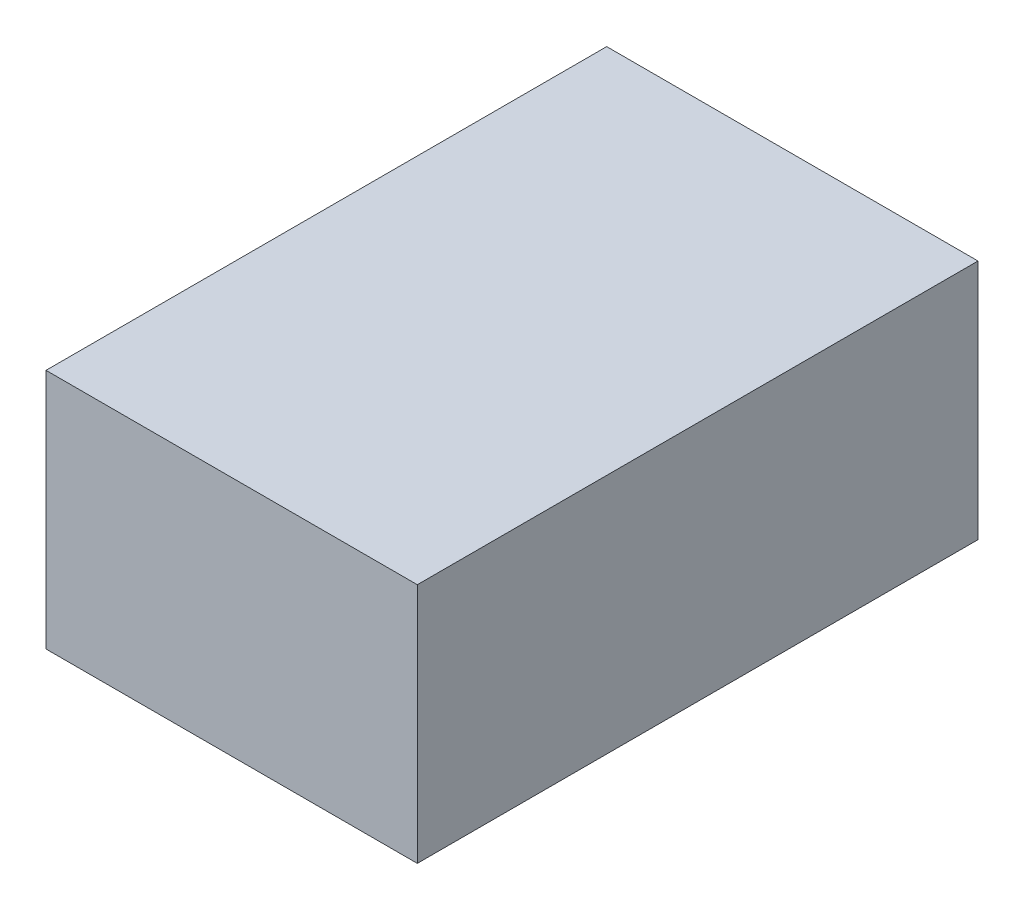
ISO-10303-21;
HEADER;
FILE_DESCRIPTION(('STEP AP214'),'2;1');
FILE_NAME('part.step','',(''),(''),'','','');
FILE_SCHEMA(('AUTOMOTIVE_DESIGN { 1 0 10303 214 1 1 1 1 }'));
ENDSEC;
DATA;
#1=APPLICATION_CONTEXT('core data for automotive mechanical design processes');
#2=APPLICATION_PROTOCOL_DEFINITION('international standard','automotive_design',2000,#1);
#3=PRODUCT_CONTEXT('',#1,'mechanical');
#4=PRODUCT('Part','Part','',(#3));
#5=PRODUCT_RELATED_PRODUCT_CATEGORY('part','',(#4));
#6=PRODUCT_DEFINITION_FORMATION('','',#4);
#7=PRODUCT_DEFINITION_CONTEXT('part definition',#1,'design');
#8=PRODUCT_DEFINITION('design','',#6,#7);
#9=PRODUCT_DEFINITION_SHAPE('','',#8);
#10=(LENGTH_UNIT() NAMED_UNIT(*) SI_UNIT(.MILLI.,.METRE.));
#11=(NAMED_UNIT(*) PLANE_ANGLE_UNIT() SI_UNIT($,.RADIAN.));
#12=(NAMED_UNIT(*) SI_UNIT($,.STERADIAN.) SOLID_ANGLE_UNIT());
#13=UNCERTAINTY_MEASURE_WITH_UNIT(LENGTH_MEASURE(1.E-05),#10,'distance_accuracy_value','');
#14=(GEOMETRIC_REPRESENTATION_CONTEXT(3) GLOBAL_UNCERTAINTY_ASSIGNED_CONTEXT((#13)) GLOBAL_UNIT_ASSIGNED_CONTEXT((#10,
#11,#12)) REPRESENTATION_CONTEXT('',''));
#15=CARTESIAN_POINT('',(0.,0.,0.));
#16=DIRECTION('',(0.,0.,1.));
#17=DIRECTION('',(1.,0.,0.));
#18=AXIS2_PLACEMENT_3D('',#15,#16,#17);
#19=CARTESIAN_POINT('',(50.,-32.5,151.));
#20=DIRECTION('',(-1.,0.,0.));
#21=DIRECTION('',(0.,0.,1.));
#22=AXIS2_PLACEMENT_3D('',#19,#20,#21);
#23=PLANE('',#22);
#24=DIRECTION('',(0.,1.,0.));
#25=VECTOR('',#24,1.);
#26=CARTESIAN_POINT('',(50.,-32.5,0.));
#27=LINE('',#26,#25);
#28=CARTESIAN_POINT('',(50.,-32.5,0.));
#29=VERTEX_POINT('',#28);
#30=CARTESIAN_POINT('',(50.,32.5,0.));
#31=VERTEX_POINT('',#30);
#32=EDGE_CURVE('E96',#29,#31,#27,.T.);
#33=ORIENTED_EDGE('',*,*,#32,.T.);
#34=DIRECTION('',(0.,0.,-1.));
#35=VECTOR('',#34,1.);
#36=CARTESIAN_POINT('',(50.,32.5,151.));
#37=LINE('',#36,#35);
#38=CARTESIAN_POINT('',(50.,32.5,151.));
#39=VERTEX_POINT('',#38);
#40=EDGE_CURVE('E11',#39,#31,#37,.T.);
#41=ORIENTED_EDGE('',*,*,#40,.F.);
#42=DIRECTION('',(0.,1.,0.));
#43=VECTOR('',#42,1.);
#44=CARTESIAN_POINT('',(50.,-32.5,151.));
#45=LINE('',#44,#43);
#46=CARTESIAN_POINT('',(50.,-32.5,151.));
#47=VERTEX_POINT('',#46);
#48=EDGE_CURVE('E84',#47,#39,#45,.T.);
#49=ORIENTED_EDGE('',*,*,#48,.F.);
#50=DIRECTION('',(0.,0.,-1.));
#51=VECTOR('',#50,1.);
#52=CARTESIAN_POINT('',(50.,-32.5,151.));
#53=LINE('',#52,#51);
#54=EDGE_CURVE('E92',#47,#29,#53,.T.);
#55=ORIENTED_EDGE('',*,*,#54,.T.);
#56=EDGE_LOOP('',(#33,#41,#49,#55));
#57=FACE_BOUND('',#56,.T.);
#58=ADVANCED_FACE('F33',(#57),#23,.F.);
#59=CARTESIAN_POINT('',(-50.,32.5,151.));
#60=DIRECTION('',(0.,-1.,0.));
#61=DIRECTION('',(0.,0.,-1.));
#62=AXIS2_PLACEMENT_3D('',#59,#60,#61);
#63=PLANE('',#62);
#64=DIRECTION('',(-1.,0.,0.));
#65=VECTOR('',#64,1.);
#66=CARTESIAN_POINT('',(-50.,32.5,0.));
#67=LINE('',#66,#65);
#68=CARTESIAN_POINT('',(-50.,32.5,0.));
#69=VERTEX_POINT('',#68);
#70=EDGE_CURVE('E88',#31,#69,#67,.T.);
#71=ORIENTED_EDGE('',*,*,#70,.T.);
#72=DIRECTION('',(0.,0.,-1.));
#73=VECTOR('',#72,1.);
#74=CARTESIAN_POINT('',(-50.,32.5,151.));
#75=LINE('',#74,#73);
#76=CARTESIAN_POINT('',(-50.,32.5,151.));
#77=VERTEX_POINT('',#76);
#78=EDGE_CURVE('E41',#77,#69,#75,.T.);
#79=ORIENTED_EDGE('',*,*,#78,.F.);
#80=DIRECTION('',(-1.,0.,0.));
#81=VECTOR('',#80,1.);
#82=CARTESIAN_POINT('',(-50.,32.5,151.));
#83=LINE('',#82,#81);
#84=EDGE_CURVE('E79',#39,#77,#83,.T.);
#85=ORIENTED_EDGE('',*,*,#84,.F.);
#86=ORIENTED_EDGE('',*,*,#40,.T.);
#87=EDGE_LOOP('',(#71,#79,#85,#86));
#88=FACE_BOUND('',#87,.T.);
#89=ADVANCED_FACE('F87',(#88),#63,.F.);
#90=CARTESIAN_POINT('',(-50.,-32.5,151.));
#91=DIRECTION('',(1.,0.,0.));
#92=DIRECTION('',(0.,0.,-1.));
#93=AXIS2_PLACEMENT_3D('',#90,#91,#92);
#94=PLANE('',#93);
#95=DIRECTION('',(0.,-1.,0.));
#96=VECTOR('',#95,1.);
#97=CARTESIAN_POINT('',(-50.,-32.5,0.));
#98=LINE('',#97,#96);
#99=CARTESIAN_POINT('',(-50.,-32.5,0.));
#100=VERTEX_POINT('',#99);
#101=EDGE_CURVE('E66',#69,#100,#98,.T.);
#102=ORIENTED_EDGE('',*,*,#101,.T.);
#103=DIRECTION('',(0.,0.,-1.));
#104=VECTOR('',#103,1.);
#105=CARTESIAN_POINT('',(-50.,-32.5,151.));
#106=LINE('',#105,#104);
#107=CARTESIAN_POINT('',(-50.,-32.5,151.));
#108=VERTEX_POINT('',#107);
#109=EDGE_CURVE('E89',#108,#100,#106,.T.);
#110=ORIENTED_EDGE('',*,*,#109,.F.);
#111=DIRECTION('',(0.,-1.,0.));
#112=VECTOR('',#111,1.);
#113=CARTESIAN_POINT('',(-50.,-32.5,151.));
#114=LINE('',#113,#112);
#115=EDGE_CURVE('E82',#77,#108,#114,.T.);
#116=ORIENTED_EDGE('',*,*,#115,.F.);
#117=ORIENTED_EDGE('',*,*,#78,.T.);
#118=EDGE_LOOP('',(#102,#110,#116,#117));
#119=FACE_BOUND('',#118,.T.);
#120=ADVANCED_FACE('F90',(#119),#94,.F.);
#121=CARTESIAN_POINT('',(-50.,-32.5,151.));
#122=DIRECTION('',(0.,1.,0.));
#123=DIRECTION('',(0.,0.,1.));
#124=AXIS2_PLACEMENT_3D('',#121,#122,#123);
#125=PLANE('',#124);
#126=DIRECTION('',(1.,0.,0.));
#127=VECTOR('',#126,1.);
#128=CARTESIAN_POINT('',(-50.,-32.5,0.));
#129=LINE('',#128,#127);
#130=EDGE_CURVE('E72',#100,#29,#129,.T.);
#131=ORIENTED_EDGE('',*,*,#130,.T.);
#132=ORIENTED_EDGE('',*,*,#54,.F.);
#133=DIRECTION('',(1.,0.,0.));
#134=VECTOR('',#133,1.);
#135=CARTESIAN_POINT('',(-50.,-32.5,151.));
#136=LINE('',#135,#134);
#137=EDGE_CURVE('E49',#108,#47,#136,.T.);
#138=ORIENTED_EDGE('',*,*,#137,.F.);
#139=ORIENTED_EDGE('',*,*,#109,.T.);
#140=EDGE_LOOP('',(#131,#132,#138,#139));
#141=FACE_BOUND('',#140,.T.);
#142=ADVANCED_FACE('F103',(#141),#125,.F.);
#143=CARTESIAN_POINT('',(0.,0.,151.));
#144=DIRECTION('',(0.,0.,-1.));
#145=DIRECTION('',(-1.,0.,0.));
#146=AXIS2_PLACEMENT_3D('',#143,#144,#145);
#147=PLANE('',#146);
#148=ORIENTED_EDGE('',*,*,#48,.T.);
#149=ORIENTED_EDGE('',*,*,#84,.T.);
#150=ORIENTED_EDGE('',*,*,#115,.T.);
#151=ORIENTED_EDGE('',*,*,#137,.T.);
#152=EDGE_LOOP('',(#148,#149,#150,#151));
#153=FACE_BOUND('',#152,.T.);
#154=ADVANCED_FACE('F80',(#153),#147,.F.);
#155=CARTESIAN_POINT('',(0.,0.,0.));
#156=DIRECTION('',(0.,0.,-1.));
#157=DIRECTION('',(-1.,0.,0.));
#158=AXIS2_PLACEMENT_3D('',#155,#156,#157);
#159=PLANE('',#158);
#160=ORIENTED_EDGE('',*,*,#32,.F.);
#161=ORIENTED_EDGE('',*,*,#130,.F.);
#162=ORIENTED_EDGE('',*,*,#101,.F.);
#163=ORIENTED_EDGE('',*,*,#70,.F.);
#164=EDGE_LOOP('',(#160,#161,#162,#163));
#165=FACE_BOUND('',#164,.T.);
#166=ADVANCED_FACE('F106',(#165),#159,.T.);
#167=CLOSED_SHELL('',(#58,#89,#120,#142,#154,#166));
#168=MANIFOLD_SOLID_BREP('B2',#167);
#169=ADVANCED_BREP_SHAPE_REPRESENTATION('',(#18,#168),#14);
#170=SHAPE_DEFINITION_REPRESENTATION(#9,#169);
ENDSEC;
END-ISO-10303-21;
